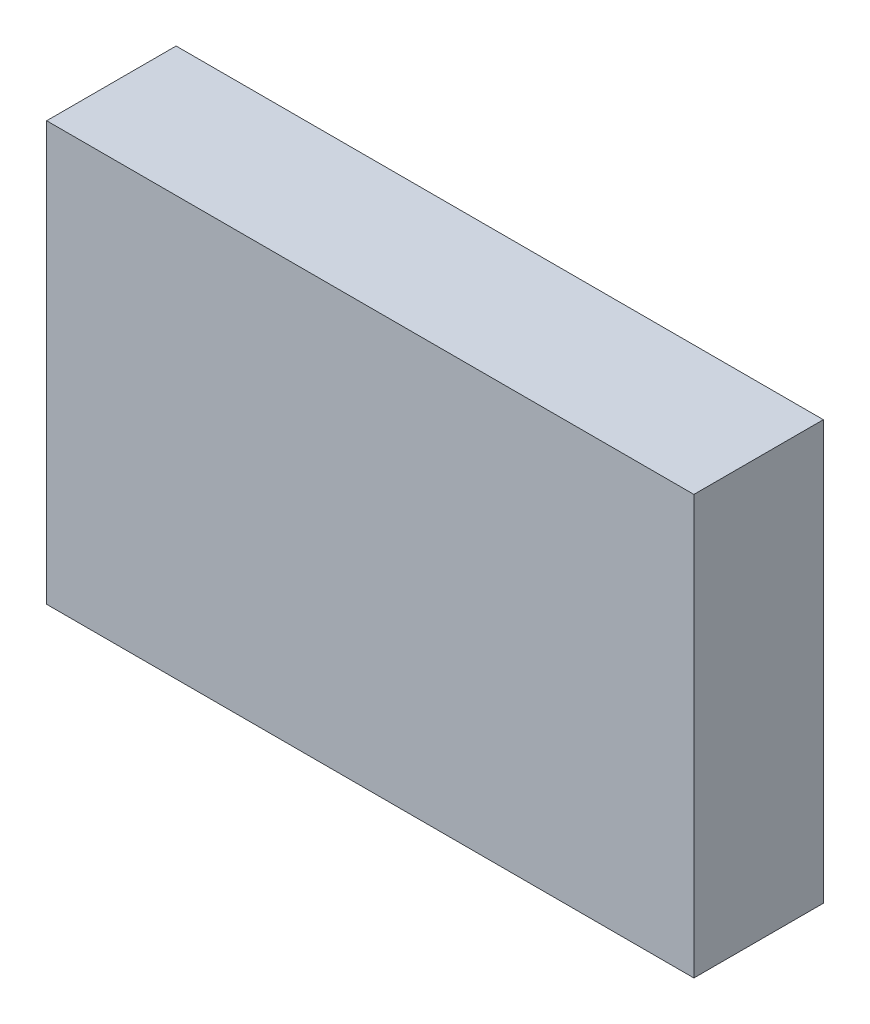
ISO-10303-21;
HEADER;
FILE_DESCRIPTION(('STEP AP214'),'2;1');
FILE_NAME('part.step','',(''),(''),'','','');
FILE_SCHEMA(('AUTOMOTIVE_DESIGN { 1 0 10303 214 1 1 1 1 }'));
ENDSEC;
DATA;
#1=APPLICATION_CONTEXT('core data for automotive mechanical design processes');
#2=APPLICATION_PROTOCOL_DEFINITION('international standard','automotive_design',2000,#1);
#3=PRODUCT_CONTEXT('',#1,'mechanical');
#4=PRODUCT('Part','Part','',(#3));
#5=PRODUCT_RELATED_PRODUCT_CATEGORY('part','',(#4));
#6=PRODUCT_DEFINITION_FORMATION('','',#4);
#7=PRODUCT_DEFINITION_CONTEXT('part definition',#1,'design');
#8=PRODUCT_DEFINITION('design','',#6,#7);
#9=PRODUCT_DEFINITION_SHAPE('','',#8);
#10=(LENGTH_UNIT() NAMED_UNIT(*) SI_UNIT(.MILLI.,.METRE.));
#11=(NAMED_UNIT(*) PLANE_ANGLE_UNIT() SI_UNIT($,.RADIAN.));
#12=(NAMED_UNIT(*) SI_UNIT($,.STERADIAN.) SOLID_ANGLE_UNIT());
#13=UNCERTAINTY_MEASURE_WITH_UNIT(LENGTH_MEASURE(1.E-05),#10,'distance_accuracy_value','');
#14=(GEOMETRIC_REPRESENTATION_CONTEXT(3) GLOBAL_UNCERTAINTY_ASSIGNED_CONTEXT((#13)) GLOBAL_UNIT_ASSIGNED_CONTEXT((#10,
#11,#12)) REPRESENTATION_CONTEXT('',''));
#15=CARTESIAN_POINT('',(0.,0.,0.));
#16=DIRECTION('',(0.,0.,1.));
#17=DIRECTION('',(1.,0.,0.));
#18=AXIS2_PLACEMENT_3D('',#15,#16,#17);
#19=CARTESIAN_POINT('',(-38.2841912839499,25.5894333386193,17.));
#20=DIRECTION('',(1.,0.,0.));
#21=DIRECTION('',(0.,1.,0.));
#22=AXIS2_PLACEMENT_3D('',#19,#20,#21);
#23=PLANE('',#22);
#24=DIRECTION('',(0.,-1.,0.));
#25=VECTOR('',#24,1.);
#26=CARTESIAN_POINT('',(-38.2841912839499,25.5894333386193,0.));
#27=LINE('',#26,#25);
#28=CARTESIAN_POINT('',(-38.2841912839499,25.5894333386193,0.));
#29=VERTEX_POINT('',#28);
#30=CARTESIAN_POINT('',(-38.2841912839499,-29.4105666613807,0.));
#31=VERTEX_POINT('',#30);
#32=EDGE_CURVE('E107',#29,#31,#27,.T.);
#33=ORIENTED_EDGE('',*,*,#32,.T.);
#34=DIRECTION('',(0.,0.,-1.));
#35=VECTOR('',#34,1.);
#36=CARTESIAN_POINT('',(-38.2841912839499,-29.4105666613807,17.));
#37=LINE('',#36,#35);
#38=CARTESIAN_POINT('',(-38.2841912839499,-29.4105666613807,17.));
#39=VERTEX_POINT('',#38);
#40=EDGE_CURVE('E11',#39,#31,#37,.T.);
#41=ORIENTED_EDGE('',*,*,#40,.F.);
#42=DIRECTION('',(0.,-1.,0.));
#43=VECTOR('',#42,1.);
#44=CARTESIAN_POINT('',(-38.2841912839499,25.5894333386193,17.));
#45=LINE('',#44,#43);
#46=CARTESIAN_POINT('',(-38.2841912839499,25.5894333386193,17.));
#47=VERTEX_POINT('',#46);
#48=EDGE_CURVE('E91',#47,#39,#45,.T.);
#49=ORIENTED_EDGE('',*,*,#48,.F.);
#50=DIRECTION('',(0.,0.,-1.));
#51=VECTOR('',#50,1.);
#52=CARTESIAN_POINT('',(-38.2841912839499,25.5894333386193,17.));
#53=LINE('',#52,#51);
#54=EDGE_CURVE('E103',#47,#29,#53,.T.);
#55=ORIENTED_EDGE('',*,*,#54,.T.);
#56=EDGE_LOOP('',(#33,#41,#49,#55));
#57=FACE_BOUND('',#56,.T.);
#58=ADVANCED_FACE('F39',(#57),#23,.F.);
#59=CARTESIAN_POINT('',(-38.2841912839499,-29.4105666613807,17.));
#60=DIRECTION('',(0.,1.,0.));
#61=DIRECTION('',(0.,0.,1.));
#62=AXIS2_PLACEMENT_3D('',#59,#60,#61);
#63=PLANE('',#62);
#64=DIRECTION('',(1.,0.,0.));
#65=VECTOR('',#64,1.);
#66=CARTESIAN_POINT('',(-38.2841912839499,-29.4105666613807,0.));
#67=LINE('',#66,#65);
#68=CARTESIAN_POINT('',(46.7158087160501,-29.4105666613807,0.));
#69=VERTEX_POINT('',#68);
#70=EDGE_CURVE('E96',#31,#69,#67,.T.);
#71=ORIENTED_EDGE('',*,*,#70,.T.);
#72=DIRECTION('',(0.,0.,-1.));
#73=VECTOR('',#72,1.);
#74=CARTESIAN_POINT('',(46.7158087160501,-29.4105666613807,17.));
#75=LINE('',#74,#73);
#76=CARTESIAN_POINT('',(46.7158087160501,-29.4105666613807,17.));
#77=VERTEX_POINT('',#76);
#78=EDGE_CURVE('E48',#77,#69,#75,.T.);
#79=ORIENTED_EDGE('',*,*,#78,.F.);
#80=DIRECTION('',(1.,0.,0.));
#81=VECTOR('',#80,1.);
#82=CARTESIAN_POINT('',(-38.2841912839499,-29.4105666613807,17.));
#83=LINE('',#82,#81);
#84=EDGE_CURVE('E86',#39,#77,#83,.T.);
#85=ORIENTED_EDGE('',*,*,#84,.F.);
#86=ORIENTED_EDGE('',*,*,#40,.T.);
#87=EDGE_LOOP('',(#71,#79,#85,#86));
#88=FACE_BOUND('',#87,.T.);
#89=ADVANCED_FACE('F95',(#88),#63,.F.);
#90=CARTESIAN_POINT('',(46.7158087160501,25.5894333386193,17.));
#91=DIRECTION('',(-1.,0.,0.));
#92=DIRECTION('',(0.,-1.,0.));
#93=AXIS2_PLACEMENT_3D('',#90,#91,#92);
#94=PLANE('',#93);
#95=DIRECTION('',(0.,1.,0.));
#96=VECTOR('',#95,1.);
#97=CARTESIAN_POINT('',(46.7158087160501,25.5894333386193,0.));
#98=LINE('',#97,#96);
#99=CARTESIAN_POINT('',(46.7158087160501,25.5894333386193,0.));
#100=VERTEX_POINT('',#99);
#101=EDGE_CURVE('E73',#69,#100,#98,.T.);
#102=ORIENTED_EDGE('',*,*,#101,.T.);
#103=DIRECTION('',(0.,0.,-1.));
#104=VECTOR('',#103,1.);
#105=CARTESIAN_POINT('',(46.7158087160501,25.5894333386193,17.));
#106=LINE('',#105,#104);
#107=CARTESIAN_POINT('',(46.7158087160501,25.5894333386193,17.));
#108=VERTEX_POINT('',#107);
#109=EDGE_CURVE('E98',#108,#100,#106,.T.);
#110=ORIENTED_EDGE('',*,*,#109,.F.);
#111=DIRECTION('',(0.,1.,0.));
#112=VECTOR('',#111,1.);
#113=CARTESIAN_POINT('',(46.7158087160501,25.5894333386193,17.));
#114=LINE('',#113,#112);
#115=EDGE_CURVE('E89',#77,#108,#114,.T.);
#116=ORIENTED_EDGE('',*,*,#115,.F.);
#117=ORIENTED_EDGE('',*,*,#78,.T.);
#118=EDGE_LOOP('',(#102,#110,#116,#117));
#119=FACE_BOUND('',#118,.T.);
#120=ADVANCED_FACE('F99',(#119),#94,.F.);
#121=CARTESIAN_POINT('',(-38.2841912839499,25.5894333386193,17.));
#122=DIRECTION('',(0.,-1.,0.));
#123=DIRECTION('',(0.,0.,-1.));
#124=AXIS2_PLACEMENT_3D('',#121,#122,#123);
#125=PLANE('',#124);
#126=DIRECTION('',(-1.,0.,0.));
#127=VECTOR('',#126,1.);
#128=CARTESIAN_POINT('',(-38.2841912839499,25.5894333386193,0.));
#129=LINE('',#128,#127);
#130=EDGE_CURVE('E79',#100,#29,#129,.T.);
#131=ORIENTED_EDGE('',*,*,#130,.T.);
#132=ORIENTED_EDGE('',*,*,#54,.F.);
#133=DIRECTION('',(-1.,0.,0.));
#134=VECTOR('',#133,1.);
#135=CARTESIAN_POINT('',(-38.2841912839499,25.5894333386193,17.));
#136=LINE('',#135,#134);
#137=EDGE_CURVE('E56',#108,#47,#136,.T.);
#138=ORIENTED_EDGE('',*,*,#137,.F.);
#139=ORIENTED_EDGE('',*,*,#109,.T.);
#140=EDGE_LOOP('',(#131,#132,#138,#139));
#141=FACE_BOUND('',#140,.T.);
#142=ADVANCED_FACE('F120',(#141),#125,.F.);
#143=CARTESIAN_POINT('',(0.,0.,17.));
#144=DIRECTION('',(0.,0.,1.));
#145=DIRECTION('',(1.,0.,0.));
#146=AXIS2_PLACEMENT_3D('',#143,#144,#145);
#147=PLANE('',#146);
#148=ORIENTED_EDGE('',*,*,#48,.T.);
#149=ORIENTED_EDGE('',*,*,#84,.T.);
#150=ORIENTED_EDGE('',*,*,#115,.T.);
#151=ORIENTED_EDGE('',*,*,#137,.T.);
#152=EDGE_LOOP('',(#148,#149,#150,#151));
#153=FACE_BOUND('',#152,.T.);
#154=ADVANCED_FACE('F87',(#153),#147,.T.);
#155=CARTESIAN_POINT('',(0.,0.,0.));
#156=DIRECTION('',(0.,0.,1.));
#157=DIRECTION('',(1.,0.,0.));
#158=AXIS2_PLACEMENT_3D('',#155,#156,#157);
#159=PLANE('',#158);
#160=ORIENTED_EDGE('',*,*,#32,.F.);
#161=ORIENTED_EDGE('',*,*,#130,.F.);
#162=ORIENTED_EDGE('',*,*,#101,.F.);
#163=ORIENTED_EDGE('',*,*,#70,.F.);
#164=EDGE_LOOP('',(#160,#161,#162,#163));
#165=FACE_BOUND('',#164,.T.);
#166=ADVANCED_FACE('F123',(#165),#159,.F.);
#167=CLOSED_SHELL('',(#58,#89,#120,#142,#154,#166));
#168=MANIFOLD_SOLID_BREP('B2',#167);
#169=ADVANCED_BREP_SHAPE_REPRESENTATION('',(#18,#168),#14);
#170=SHAPE_DEFINITION_REPRESENTATION(#9,#169);
ENDSEC;
END-ISO-10303-21;
